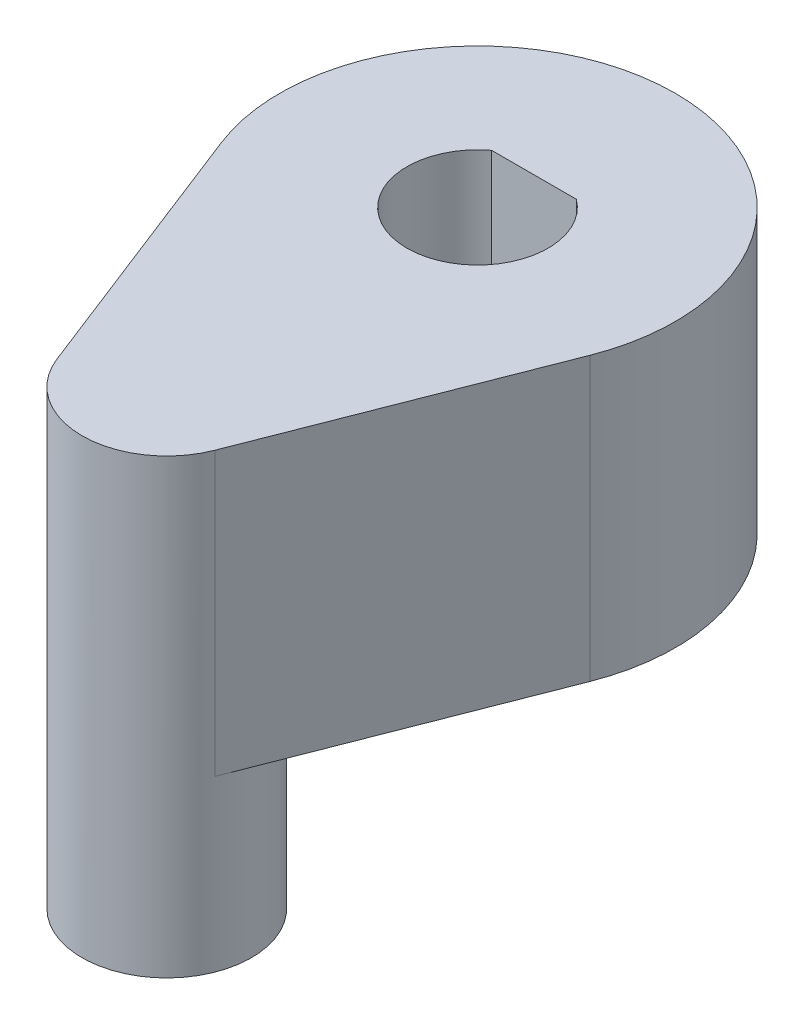
ISO-10303-21;
HEADER;
FILE_DESCRIPTION(('STEP AP214'),'2;1');
FILE_NAME('part.step','',(''),(''),'','','');
FILE_SCHEMA(('AUTOMOTIVE_DESIGN { 1 0 10303 214 1 1 1 1 }'));
ENDSEC;
DATA;
#1=APPLICATION_CONTEXT('core data for automotive mechanical design processes');
#2=APPLICATION_PROTOCOL_DEFINITION('international standard','automotive_design',2000,#1);
#3=PRODUCT_CONTEXT('',#1,'mechanical');
#4=PRODUCT('Part','Part','',(#3));
#5=PRODUCT_RELATED_PRODUCT_CATEGORY('part','',(#4));
#6=PRODUCT_DEFINITION_FORMATION('','',#4);
#7=PRODUCT_DEFINITION_CONTEXT('part definition',#1,'design');
#8=PRODUCT_DEFINITION('design','',#6,#7);
#9=PRODUCT_DEFINITION_SHAPE('','',#8);
#10=(LENGTH_UNIT() NAMED_UNIT(*) SI_UNIT(.MILLI.,.METRE.));
#11=(NAMED_UNIT(*) PLANE_ANGLE_UNIT() SI_UNIT($,.RADIAN.));
#12=(NAMED_UNIT(*) SI_UNIT($,.STERADIAN.) SOLID_ANGLE_UNIT());
#13=UNCERTAINTY_MEASURE_WITH_UNIT(LENGTH_MEASURE(1.E-05),#10,'distance_accuracy_value','');
#14=(GEOMETRIC_REPRESENTATION_CONTEXT(3) GLOBAL_UNCERTAINTY_ASSIGNED_CONTEXT((#13)) GLOBAL_UNIT_ASSIGNED_CONTEXT((#10,
#11,#12)) REPRESENTATION_CONTEXT('',''));
#15=CARTESIAN_POINT('',(0.,0.,0.));
#16=DIRECTION('',(0.,0.,1.));
#17=DIRECTION('',(1.,0.,0.));
#18=AXIS2_PLACEMENT_3D('',#15,#16,#17);
#19=CARTESIAN_POINT('',(-1.5,10.,-2.));
#20=DIRECTION('',(0.,0.,1.));
#21=DIRECTION('',(1.,0.,0.));
#22=AXIS2_PLACEMENT_3D('',#19,#20,#21);
#23=PLANE('',#22);
#24=CARTESIAN_POINT('',(0.,5.,-2.));
#25=DIRECTION('',(0.,0.,1.));
#26=DIRECTION('',(1.,0.,0.));
#27=AXIS2_PLACEMENT_3D('',#24,#25,#26);
#28=CIRCLE('',#27,1.55);
#29=CARTESIAN_POINT('',(1.5,5.39051248379533,-2.));
#30=VERTEX_POINT('',#29);
#31=CARTESIAN_POINT('',(-1.5,5.39051248379533,-2.));
#32=VERTEX_POINT('',#31);
#33=EDGE_CURVE('E167',#30,#32,#28,.T.);
#34=ORIENTED_EDGE('',*,*,#33,.F.);
#35=DIRECTION('',(0.,-1.,0.));
#36=VECTOR('',#35,1.);
#37=CARTESIAN_POINT('',(1.5,10.,-2.));
#38=LINE('',#37,#36);
#39=CARTESIAN_POINT('',(1.5,10.,-2.));
#40=VERTEX_POINT('',#39);
#41=EDGE_CURVE('E251',#40,#30,#38,.T.);
#42=ORIENTED_EDGE('',*,*,#41,.F.);
#43=DIRECTION('',(-1.,0.,0.));
#44=VECTOR('',#43,1.);
#45=CARTESIAN_POINT('',(-1.5,10.,-2.));
#46=LINE('',#45,#44);
#47=CARTESIAN_POINT('',(-1.5,10.,-2.));
#48=VERTEX_POINT('',#47);
#49=EDGE_CURVE('E239',#40,#48,#46,.T.);
#50=ORIENTED_EDGE('',*,*,#49,.T.);
#51=DIRECTION('',(0.,-1.,0.));
#52=VECTOR('',#51,1.);
#53=CARTESIAN_POINT('',(-1.5,10.,-2.));
#54=LINE('',#53,#52);
#55=EDGE_CURVE('E247',#48,#32,#54,.T.);
#56=ORIENTED_EDGE('',*,*,#55,.T.);
#57=EDGE_LOOP('',(#34,#42,#50,#56));
#58=FACE_BOUND('',#57,.T.);
#59=ADVANCED_FACE('F37',(#58),#23,.T.);
#60=CARTESIAN_POINT('',(0.,0.,0.));
#61=DIRECTION('',(0.,1.,0.));
#62=DIRECTION('',(0.,0.,1.));
#63=AXIS2_PLACEMENT_3D('',#60,#61,#62);
#64=PLANE('',#63);
#65=CARTESIAN_POINT('',(0.,0.,0.));
#66=DIRECTION('',(0.,1.,0.));
#67=DIRECTION('',(0.,0.,1.));
#68=AXIS2_PLACEMENT_3D('',#65,#66,#67);
#69=CIRCLE('',#68,2.5);
#70=CARTESIAN_POINT('',(-1.5,0.,-2.));
#71=VERTEX_POINT('',#70);
#72=CARTESIAN_POINT('',(1.5,0.,-2.));
#73=VERTEX_POINT('',#72);
#74=EDGE_CURVE('E235',#71,#73,#69,.T.);
#75=ORIENTED_EDGE('',*,*,#74,.T.);
#76=DIRECTION('',(-1.,0.,0.));
#77=VECTOR('',#76,1.);
#78=CARTESIAN_POINT('',(-1.5,0.,-2.));
#79=LINE('',#78,#77);
#80=EDGE_CURVE('E240',#73,#71,#79,.T.);
#81=ORIENTED_EDGE('',*,*,#80,.T.);
#82=EDGE_LOOP('',(#75,#81));
#83=FACE_BOUND('',#82,.T.);
#84=CARTESIAN_POINT('',(0.,0.,0.));
#85=DIRECTION('',(0.,1.,0.));
#86=DIRECTION('',(0.,0.,1.));
#87=AXIS2_PLACEMENT_3D('',#84,#85,#86);
#88=CIRCLE('',#87,7.);
#89=CARTESIAN_POINT('',(6.5207868510652,0.,2.54545454545454));
#90=VERTEX_POINT('',#89);
#91=CARTESIAN_POINT('',(-6.5207868510652,0.,2.54545454545454));
#92=VERTEX_POINT('',#91);
#93=EDGE_CURVE('E47',#90,#92,#88,.T.);
#94=ORIENTED_EDGE('',*,*,#93,.F.);
#95=DIRECTION('',(-0.363636363636364,0.,0.9315409787236));
#96=VECTOR('',#95,1.);
#97=CARTESIAN_POINT('',(6.5207868510652,0.,2.54545454545455));
#98=LINE('',#97,#96);
#99=CARTESIAN_POINT('',(2.7946229361708,0.,12.0909090909091));
#100=VERTEX_POINT('',#99);
#101=EDGE_CURVE('E160',#90,#100,#98,.T.);
#102=ORIENTED_EDGE('',*,*,#101,.T.);
#103=CARTESIAN_POINT('',(0.,0.,11.));
#104=DIRECTION('',(0.,1.,0.));
#105=DIRECTION('',(0.,0.,1.));
#106=AXIS2_PLACEMENT_3D('',#103,#104,#105);
#107=CIRCLE('',#106,3.);
#108=CARTESIAN_POINT('',(-2.7946229361708,0.,12.0909090909091));
#109=VERTEX_POINT('',#108);
#110=EDGE_CURVE('E131',#109,#100,#107,.F.);
#111=ORIENTED_EDGE('',*,*,#110,.F.);
#112=DIRECTION('',(-0.363636363636363,0.,-0.9315409787236));
#113=VECTOR('',#112,1.);
#114=CARTESIAN_POINT('',(-6.5207868510652,0.,2.54545454545454));
#115=LINE('',#114,#113);
#116=EDGE_CURVE('E158',#109,#92,#115,.T.);
#117=ORIENTED_EDGE('',*,*,#116,.T.);
#118=EDGE_LOOP('',(#94,#102,#111,#117));
#119=FACE_BOUND('',#118,.T.);
#120=DIRECTION('',(0.,0.,-1.));
#121=VECTOR('',#120,1.);
#122=CARTESIAN_POINT('',(2.85,0.,-5.25));
#123=LINE('',#122,#121);
#124=CARTESIAN_POINT('',(2.85,0.,-2.75));
#125=VERTEX_POINT('',#124);
#126=CARTESIAN_POINT('',(2.85,0.,-5.25));
#127=VERTEX_POINT('',#126);
#128=EDGE_CURVE('E204',#125,#127,#123,.T.);
#129=ORIENTED_EDGE('',*,*,#128,.T.);
#130=DIRECTION('',(-1.,0.,0.));
#131=VECTOR('',#130,1.);
#132=CARTESIAN_POINT('',(-2.85,0.,-5.25));
#133=LINE('',#132,#131);
#134=CARTESIAN_POINT('',(-2.85,0.,-5.25));
#135=VERTEX_POINT('',#134);
#136=EDGE_CURVE('E218',#127,#135,#133,.T.);
#137=ORIENTED_EDGE('',*,*,#136,.T.);
#138=DIRECTION('',(0.,0.,1.));
#139=VECTOR('',#138,1.);
#140=CARTESIAN_POINT('',(-2.85,0.,-5.25));
#141=LINE('',#140,#139);
#142=CARTESIAN_POINT('',(-2.85,0.,-2.75));
#143=VERTEX_POINT('',#142);
#144=EDGE_CURVE('E221',#135,#143,#141,.T.);
#145=ORIENTED_EDGE('',*,*,#144,.T.);
#146=DIRECTION('',(1.,0.,0.));
#147=VECTOR('',#146,1.);
#148=CARTESIAN_POINT('',(-2.85,0.,-2.75));
#149=LINE('',#148,#147);
#150=EDGE_CURVE('E209',#143,#125,#149,.T.);
#151=ORIENTED_EDGE('',*,*,#150,.T.);
#152=EDGE_LOOP('',(#129,#137,#145,#151));
#153=FACE_BOUND('',#152,.T.);
#154=ADVANCED_FACE('F264',(#83,#119,#153),#64,.F.);
#155=CARTESIAN_POINT('',(0.,10.,0.));
#156=DIRECTION('',(0.,1.,0.));
#157=DIRECTION('',(0.,0.,1.));
#158=AXIS2_PLACEMENT_3D('',#155,#156,#157);
#159=PLANE('',#158);
#160=CARTESIAN_POINT('',(0.,10.,0.));
#161=DIRECTION('',(0.,1.,0.));
#162=DIRECTION('',(0.,0.,1.));
#163=AXIS2_PLACEMENT_3D('',#160,#161,#162);
#164=CIRCLE('',#163,7.);
#165=CARTESIAN_POINT('',(6.5207868510652,10.,2.54545454545454));
#166=VERTEX_POINT('',#165);
#167=CARTESIAN_POINT('',(-6.5207868510652,10.,2.54545454545454));
#168=VERTEX_POINT('',#167);
#169=EDGE_CURVE('E11',#166,#168,#164,.T.);
#170=ORIENTED_EDGE('',*,*,#169,.T.);
#171=DIRECTION('',(0.363636363636363,0.,0.9315409787236));
#172=VECTOR('',#171,1.);
#173=CARTESIAN_POINT('',(-6.5207868510652,10.,2.54545454545454));
#174=LINE('',#173,#172);
#175=CARTESIAN_POINT('',(-2.7946229361708,10.,12.0909090909091));
#176=VERTEX_POINT('',#175);
#177=EDGE_CURVE('E146',#168,#176,#174,.T.);
#178=ORIENTED_EDGE('',*,*,#177,.T.);
#179=CARTESIAN_POINT('',(0.,10.,11.));
#180=DIRECTION('',(0.,1.,0.));
#181=DIRECTION('',(0.,0.,1.));
#182=AXIS2_PLACEMENT_3D('',#179,#180,#181);
#183=CIRCLE('',#182,3.);
#184=CARTESIAN_POINT('',(2.7946229361708,10.,12.0909090909091));
#185=VERTEX_POINT('',#184);
#186=EDGE_CURVE('E128',#185,#176,#183,.F.);
#187=ORIENTED_EDGE('',*,*,#186,.F.);
#188=DIRECTION('',(0.363636363636364,0.,-0.9315409787236));
#189=VECTOR('',#188,1.);
#190=CARTESIAN_POINT('',(6.5207868510652,10.,2.54545454545455));
#191=LINE('',#190,#189);
#192=EDGE_CURVE('E144',#185,#166,#191,.T.);
#193=ORIENTED_EDGE('',*,*,#192,.T.);
#194=EDGE_LOOP('',(#170,#178,#187,#193));
#195=FACE_BOUND('',#194,.T.);
#196=ORIENTED_EDGE('',*,*,#49,.F.);
#197=CARTESIAN_POINT('',(0.,10.,0.));
#198=DIRECTION('',(0.,1.,0.));
#199=DIRECTION('',(0.,0.,1.));
#200=AXIS2_PLACEMENT_3D('',#197,#198,#199);
#201=CIRCLE('',#200,2.5);
#202=EDGE_CURVE('E236',#48,#40,#201,.T.);
#203=ORIENTED_EDGE('',*,*,#202,.F.);
#204=EDGE_LOOP('',(#196,#203));
#205=FACE_BOUND('',#204,.T.);
#206=ADVANCED_FACE('F142',(#195,#205),#159,.T.);
#207=CARTESIAN_POINT('',(0.,10.,0.));
#208=DIRECTION('',(0.,-1.,0.));
#209=DIRECTION('',(0.,0.,-1.));
#210=AXIS2_PLACEMENT_3D('',#207,#208,#209);
#211=CYLINDRICAL_SURFACE('',#210,7.);
#212=CARTESIAN_POINT('',(0.,6.55,-7.));
#213=CARTESIAN_POINT('',(-0.0859402928343233,6.5499971026125,-6.99999841906637));
#214=CARTESIAN_POINT('',(-0.171915366286513,6.54282839045857,-6.99840128538259));
#215=CARTESIAN_POINT('',(-0.341421620554515,6.51437378637307,-6.99218430494816));
#216=CARTESIAN_POINT('',(-0.424951041449546,6.49307797704688,-6.98756233475606));
#217=CARTESIAN_POINT('',(-0.587091931546828,6.43707031796601,-6.97581007385335));
#218=CARTESIAN_POINT('',(-0.665708499775027,6.40237265593535,-6.96868243645437));
#219=CARTESIAN_POINT('',(-0.816001759123197,6.32059166784691,-6.95268727735697));
#220=CARTESIAN_POINT('',(-0.887678595155908,6.27350860049258,-6.94381979200109));
#221=CARTESIAN_POINT('',(-1.02323727587292,6.16747523843312,-6.92515283476601));
#222=CARTESIAN_POINT('',(-1.08698885409818,6.10836046704675,-6.91534156588722));
#223=CARTESIAN_POINT('',(-1.2037575950557,5.98029477158262,-6.89597555849522));
#224=CARTESIAN_POINT('',(-1.25677378159032,5.91134295396705,-6.88642084337959));
#225=CARTESIAN_POINT('',(-1.35114462199064,5.76459336115734,-6.86853324882406));
#226=CARTESIAN_POINT('',(-1.39236002454389,5.68670403110346,-6.86021547515364));
#227=CARTESIAN_POINT('',(-1.46106593396905,5.52489008405583,-6.84591309236291));
#228=CARTESIAN_POINT('',(-1.48855812582036,5.44096620945099,-6.8399281968242));
#229=CARTESIAN_POINT('',(-1.52860555632643,5.27088018450822,-6.83108944228684));
#230=CARTESIAN_POINT('',(-1.54139173571974,5.18477497692508,-6.82818723056561));
#231=CARTESIAN_POINT('',(-1.55238237694498,5.0115964575771,-6.82569726323977));
#232=CARTESIAN_POINT('',(-1.55058867730685,4.92452326925792,-6.82610908973325));
#233=CARTESIAN_POINT('',(-1.53265619455219,4.75360157459396,-6.83015691737853));
#234=CARTESIAN_POINT('',(-1.5167862412788,4.66972321520902,-6.83373249379431));
#235=CARTESIAN_POINT('',(-1.47157788763528,4.50584981217977,-6.84360934760427));
#236=CARTESIAN_POINT('',(-1.44223871480859,4.42585499154647,-6.84991078132453));
#237=CARTESIAN_POINT('',(-1.3706793767177,4.27126654075227,-6.86458854546672));
#238=CARTESIAN_POINT('',(-1.32835631982882,4.19672216824755,-6.87298134552846));
#239=CARTESIAN_POINT('',(-1.23210292316606,4.05569422415149,-6.89088615115621));
#240=CARTESIAN_POINT('',(-1.17817096399455,3.98921177919317,-6.9003983127849));
#241=CARTESIAN_POINT('',(-1.05881012883068,3.86464770376549,-6.91972892912363));
#242=CARTESIAN_POINT('',(-0.993152793365391,3.80678509686255,-6.92954949801286));
#243=CARTESIAN_POINT('',(-0.852954564444784,3.70285596847728,-6.94819843257607));
#244=CARTESIAN_POINT('',(-0.778413502253328,3.65678967110457,-6.95702677939775));
#245=CARTESIAN_POINT('',(-0.622292766056107,3.57770459198674,-6.97272633921555));
#246=CARTESIAN_POINT('',(-0.540697800900798,3.54471506756477,-6.97959315410242));
#247=CARTESIAN_POINT('',(-0.372936579150778,3.4929763360206,-6.99056333118812));
#248=CARTESIAN_POINT('',(-0.286771006253085,3.47422500546055,-6.99466710544747));
#249=CARTESIAN_POINT('',(-0.114192707035712,3.45181480209345,-6.99958997510097));
#250=CARTESIAN_POINT('',(-0.0278206262918196,3.44785681934468,-7.00047415849713));
#251=CARTESIAN_POINT('',(0.144350628221089,3.45433415510444,-6.99904086020288));
#252=CARTESIAN_POINT('',(0.230149841448108,3.46476847180506,-6.99672360135594));
#253=CARTESIAN_POINT('',(0.397744849449805,3.49948628898276,-6.9891889188855));
#254=CARTESIAN_POINT('',(0.479574864094173,3.52361239100744,-6.98400447294378));
#255=CARTESIAN_POINT('',(0.638026266705384,3.58485380965083,-6.97131593594165));
#256=CARTESIAN_POINT('',(0.714647202721151,3.62197025162666,-6.96381164391885));
#257=CARTESIAN_POINT('',(0.861738503621745,3.70875837976315,-6.94715559166856));
#258=CARTESIAN_POINT('',(0.932102988259884,3.75860511788197,-6.93798142071399));
#259=CARTESIAN_POINT('',(1.06357579121295,3.86920892615667,-6.91904806662473));
#260=CARTESIAN_POINT('',(1.12468287338637,3.92996745100095,-6.90928880560534));
#261=CARTESIAN_POINT('',(1.23709298830687,4.06204416094826,-6.89005959214247));
#262=CARTESIAN_POINT('',(1.2881886558264,4.13354038417455,-6.88059860681403));
#263=CARTESIAN_POINT('',(1.3776490309592,4.28427459888708,-6.86324763187886));
#264=CARTESIAN_POINT('',(1.41601429370752,4.36351225259748,-6.85535757377468));
#265=CARTESIAN_POINT('',(1.47866263467366,4.52705286879932,-6.84211830442032));
#266=CARTESIAN_POINT('',(1.50302558111365,4.61132401405355,-6.83675471468901));
#267=CARTESIAN_POINT('',(1.53721019423603,4.78289844328262,-6.82915054094163));
#268=CARTESIAN_POINT('',(1.54703425294282,4.87020122605481,-6.82690944319814));
#269=CARTESIAN_POINT('',(1.55175845978007,5.04326846298619,-6.82583693966597));
#270=CARTESIAN_POINT('',(1.54698758637967,5.12902363413171,-6.826930369878));
#271=CARTESIAN_POINT('',(1.52339423682576,5.2984754415871,-6.83223342154267));
#272=CARTESIAN_POINT('',(1.50457193485786,5.38217210340157,-6.83644300436657));
#273=CARTESIAN_POINT('',(1.45357074040883,5.54486187543883,-6.84746696206354));
#274=CARTESIAN_POINT('',(1.4214408580609,5.62387104094714,-6.85427177183658));
#275=CARTESIAN_POINT('',(1.34477823920642,5.7754258919239,-6.86972297868691));
#276=CARTESIAN_POINT('',(1.3002441737015,5.84797088371349,-6.87836957307173));
#277=CARTESIAN_POINT('',(1.19895108738809,5.98615727978365,-6.89675379681187));
#278=CARTESIAN_POINT('',(1.14195810498469,6.05162470700255,-6.90651030472363));
#279=CARTESIAN_POINT('',(1.01783769769875,6.17217431518667,-6.92588941792459));
#280=CARTESIAN_POINT('',(0.95070792977344,6.2272540884859,-6.93551199169281));
#281=CARTESIAN_POINT('',(0.807137839004441,6.32617098507363,-6.95369169401918));
#282=CARTESIAN_POINT('',(0.730585049628897,6.36984797476714,-6.96223286023274));
#283=CARTESIAN_POINT('',(0.571050729385048,6.4436452838494,-6.97712667819099));
#284=CARTESIAN_POINT('',(0.488074594741203,6.47377684088244,-6.98348114304984));
#285=CARTESIAN_POINT('',(0.337527303953331,6.51432972629152,-6.99216733927604));
#286=CARTESIAN_POINT('',(0.270763511878732,6.52768029202223,-6.99508623692342));
#287=CARTESIAN_POINT('',(0.136007036532056,6.54551636959757,-6.99900314828042));
#288=CARTESIAN_POINT('',(0.0680144104637138,6.55000229303504,-7.00000125117411));
#289=CARTESIAN_POINT('',(0.,6.55,-7.));
#290=B_SPLINE_CURVE_WITH_KNOTS('',3,(#212,#213,#214,#215,#216,#217,#218,#219,#220,#221,#222,
#223,#224,#225,#226,#227,#228,#229,#230,#231,#232,#233,#234,#235,#236,#237,#238,#239,#240,#241,
#242,#243,#244,#245,#246,#247,#248,#249,#250,#251,#252,#253,#254,#255,#256,#257,#258,#259,#260,
#261,#262,#263,#264,#265,#266,#267,#268,#269,#270,#271,#272,#273,#274,#275,#276,#277,#278,#279,
#280,#281,#282,#283,#284,#285,#286,#287,#288,#289),.UNSPECIFIED.,.T.,.F.,(4,2,2,2,2,2,2,2,2,2,2,
2,2,2,2,2,2,2,2,2,2,2,2,2,2,2,2,2,2,2,2,2,2,2,2,2,2,2,4),(0.,0.257571895706206,
0.515324801647956,0.772805584904142,1.03028099038845,1.29154626135011,1.55283527919716,
1.81709121175841,2.08131469015102,2.34132962168391,2.60131176571435,2.85643315384419,
3.11156917495343,3.36878168131653,3.6260300911236,3.88898398287271,4.15194286992383,
4.41548681160704,4.6789914414814,4.93713846382466,5.19526751817912,5.45048758897706,
5.70572977504243,5.96469086891337,6.22368651145372,6.48758231585737,6.7514666110378,
7.01383039666133,7.2761510118317,7.5326026688112,7.78905114679403,8.04456343925961,
8.30010311814187,8.56093215876119,8.82182158062535,9.08619854982529,9.35035577837665,
9.55421142653642,9.75805760928392),.UNSPECIFIED.);
#291=CARTESIAN_POINT('',(0.,6.55,-7.));
#292=VERTEX_POINT('',#291);
#293=EDGE_CURVE('E198',#292,#292,#290,.T.);
#294=ORIENTED_EDGE('',*,*,#293,.T.);
#295=EDGE_LOOP('',(#294));
#296=FACE_BOUND('',#295,.T.);
#297=ORIENTED_EDGE('',*,*,#169,.F.);
#298=DIRECTION('',(0.,1.,0.));
#299=VECTOR('',#298,1.);
#300=CARTESIAN_POINT('',(6.5207868510652,-16.1616319444367,2.54545454545454));
#301=LINE('',#300,#299);
#302=EDGE_CURVE('E136',#90,#166,#301,.T.);
#303=ORIENTED_EDGE('',*,*,#302,.F.);
#304=ORIENTED_EDGE('',*,*,#93,.T.);
#305=DIRECTION('',(0.,1.,0.));
#306=VECTOR('',#305,1.);
#307=CARTESIAN_POINT('',(-6.5207868510652,-16.1616319444367,2.54545454545454));
#308=LINE('',#307,#306);
#309=EDGE_CURVE('E59',#92,#168,#308,.T.);
#310=ORIENTED_EDGE('',*,*,#309,.T.);
#311=EDGE_LOOP('',(#297,#303,#304,#310));
#312=FACE_BOUND('',#311,.T.);
#313=ADVANCED_FACE('F39',(#296,#312),#211,.T.);
#314=CARTESIAN_POINT('',(0.,10.,0.));
#315=DIRECTION('',(0.,-1.,0.));
#316=DIRECTION('',(0.,0.,-1.));
#317=AXIS2_PLACEMENT_3D('',#314,#315,#316);
#318=CYLINDRICAL_SURFACE('',#317,2.5);
#319=CARTESIAN_POINT('',(-1.5,5.39051248379533,-2.));
#320=CARTESIAN_POINT('',(-1.50889726427483,5.3563390489348,-1.99332400059564));
#321=CARTESIAN_POINT('',(-1.51665892906326,5.32172827493054,-1.98741367603017));
#322=CARTESIAN_POINT('',(-1.52982546394848,5.25179839877789,-1.97729726484905));
#323=CARTESIAN_POINT('',(-1.53522906419274,5.21647892566602,-1.9730920965713));
#324=CARTESIAN_POINT('',(-1.54752941918455,5.11174060415883,-1.96348499081697));
#325=CARTESIAN_POINT('',(-1.55101676953309,5.04161986961238,-1.96070346690848));
#326=CARTESIAN_POINT('',(-1.54863283976531,4.91090202123434,-1.96258272824291));
#327=CARTESIAN_POINT('',(-1.5439306735321,4.85026378613153,-1.96631393591315));
#328=CARTESIAN_POINT('',(-1.53158276857935,4.7597621367887,-1.97592499163649));
#329=CARTESIAN_POINT('',(-1.52649094275629,4.72931240946195,-1.97986953956135));
#330=CARTESIAN_POINT('',(-1.51454923292454,4.66896119922362,-1.98901880052492));
#331=CARTESIAN_POINT('',(-1.50769991649543,4.63905954264731,-1.99422310669548));
#332=CARTESIAN_POINT('',(-1.5,4.60948751620467,-2.));
#333=B_SPLINE_CURVE_WITH_KNOTS('',3,(#319,#320,#321,#322,#323,#324,#325,#326,#327,#328,#329,
#330,#331,#332),.UNSPECIFIED.,.F.,.F.,(4,2,2,2,2,2,4),(0.,0.107765179269089,0.215588320276379,
0.425241060480937,0.607355307132323,0.70065446021502,0.793923520282873),.UNSPECIFIED.);
#334=CARTESIAN_POINT('',(-1.5,4.60948751620467,-2.));
#335=VERTEX_POINT('',#334);
#336=EDGE_CURVE('E175',#32,#335,#333,.T.);
#337=ORIENTED_EDGE('',*,*,#336,.F.);
#338=ORIENTED_EDGE('',*,*,#55,.F.);
#339=ORIENTED_EDGE('',*,*,#202,.T.);
#340=ORIENTED_EDGE('',*,*,#41,.T.);
#341=CARTESIAN_POINT('',(1.5,4.60948751620467,-2.));
#342=CARTESIAN_POINT('',(1.50889726427483,4.6436609510652,-1.99332400059564));
#343=CARTESIAN_POINT('',(1.51665892906326,4.67827172506946,-1.98741367603017));
#344=CARTESIAN_POINT('',(1.52982546394848,4.74820160122212,-1.97729726484905));
#345=CARTESIAN_POINT('',(1.53522906419274,4.78352107433398,-1.9730920965713));
#346=CARTESIAN_POINT('',(1.54752941918455,4.88825939584117,-1.96348499081697));
#347=CARTESIAN_POINT('',(1.55101676953309,4.95838013038762,-1.96070346690848));
#348=CARTESIAN_POINT('',(1.54863283976531,5.08909797876566,-1.96258272824291));
#349=CARTESIAN_POINT('',(1.5439306735321,5.14973621386847,-1.96631393591315));
#350=CARTESIAN_POINT('',(1.53158276857935,5.2402378632113,-1.97592499163649));
#351=CARTESIAN_POINT('',(1.52649094275629,5.27068759053805,-1.97986953956135));
#352=CARTESIAN_POINT('',(1.51454923292454,5.33103880077638,-1.98901880052492));
#353=CARTESIAN_POINT('',(1.50769991649543,5.36094045735269,-1.99422310669548));
#354=CARTESIAN_POINT('',(1.5,5.39051248379533,-2.));
#355=B_SPLINE_CURVE_WITH_KNOTS('',3,(#341,#342,#343,#344,#345,#346,#347,#348,#349,#350,#351,
#352,#353,#354),.UNSPECIFIED.,.F.,.F.,(4,2,2,2,2,2,4),(0.,0.10776517926909,0.215588320276379,
0.425241060480937,0.607355307132323,0.70065446021502,0.793923520282873),.UNSPECIFIED.);
#356=CARTESIAN_POINT('',(1.5,4.60948751620467,-2.));
#357=VERTEX_POINT('',#356);
#358=EDGE_CURVE('E166',#357,#30,#355,.T.);
#359=ORIENTED_EDGE('',*,*,#358,.F.);
#360=EDGE_CURVE('E250',#357,#73,#38,.T.);
#361=ORIENTED_EDGE('',*,*,#360,.T.);
#362=ORIENTED_EDGE('',*,*,#74,.F.);
#363=EDGE_CURVE('E242',#335,#71,#54,.T.);
#364=ORIENTED_EDGE('',*,*,#363,.F.);
#365=EDGE_LOOP('',(#337,#338,#339,#340,#359,#361,#362,#364));
#366=FACE_BOUND('',#365,.T.);
#367=ADVANCED_FACE('F181',(#366),#318,.F.);
#368=EDGE_CURVE('E164',#335,#357,#28,.T.);
#369=ORIENTED_EDGE('',*,*,#368,.F.);
#370=ORIENTED_EDGE('',*,*,#363,.T.);
#371=ORIENTED_EDGE('',*,*,#80,.F.);
#372=ORIENTED_EDGE('',*,*,#360,.F.);
#373=EDGE_LOOP('',(#369,#370,#371,#372));
#374=FACE_BOUND('',#373,.T.);
#375=ADVANCED_FACE('F262',(#374),#23,.T.);
#376=CARTESIAN_POINT('',(2.85,8.,-5.25));
#377=DIRECTION('',(-1.,0.,0.));
#378=DIRECTION('',(0.,0.,1.));
#379=AXIS2_PLACEMENT_3D('',#376,#377,#378);
#380=PLANE('',#379);
#381=ORIENTED_EDGE('',*,*,#128,.F.);
#382=DIRECTION('',(0.,-1.,0.));
#383=VECTOR('',#382,1.);
#384=CARTESIAN_POINT('',(2.85,8.,-2.75));
#385=LINE('',#384,#383);
#386=CARTESIAN_POINT('',(2.85,8.,-2.75));
#387=VERTEX_POINT('',#386);
#388=EDGE_CURVE('E215',#387,#125,#385,.T.);
#389=ORIENTED_EDGE('',*,*,#388,.F.);
#390=DIRECTION('',(0.,0.,-1.));
#391=VECTOR('',#390,1.);
#392=CARTESIAN_POINT('',(2.85,8.,-5.25));
#393=LINE('',#392,#391);
#394=CARTESIAN_POINT('',(2.85,8.,-5.25));
#395=VERTEX_POINT('',#394);
#396=EDGE_CURVE('E205',#387,#395,#393,.T.);
#397=ORIENTED_EDGE('',*,*,#396,.T.);
#398=DIRECTION('',(0.,-1.,0.));
#399=VECTOR('',#398,1.);
#400=CARTESIAN_POINT('',(2.85,8.,-5.25));
#401=LINE('',#400,#399);
#402=EDGE_CURVE('E232',#395,#127,#401,.T.);
#403=ORIENTED_EDGE('',*,*,#402,.T.);
#404=EDGE_LOOP('',(#381,#389,#397,#403));
#405=FACE_BOUND('',#404,.T.);
#406=ADVANCED_FACE('F271',(#405),#380,.T.);
#407=CARTESIAN_POINT('',(-2.85,8.,-5.25));
#408=DIRECTION('',(0.,0.,1.));
#409=DIRECTION('',(1.,0.,0.));
#410=AXIS2_PLACEMENT_3D('',#407,#408,#409);
#411=PLANE('',#410);
#412=CARTESIAN_POINT('',(0.,5.,-5.25));
#413=DIRECTION('',(0.,0.,1.));
#414=DIRECTION('',(1.,0.,0.));
#415=AXIS2_PLACEMENT_3D('',#412,#413,#414);
#416=CIRCLE('',#415,1.55);
#417=CARTESIAN_POINT('',(1.55,5.,-5.25));
#418=VERTEX_POINT('',#417);
#419=EDGE_CURVE('E161',#418,#418,#416,.T.);
#420=ORIENTED_EDGE('',*,*,#419,.F.);
#421=EDGE_LOOP('',(#420));
#422=FACE_BOUND('',#421,.T.);
#423=ORIENTED_EDGE('',*,*,#136,.F.);
#424=ORIENTED_EDGE('',*,*,#402,.F.);
#425=DIRECTION('',(-1.,0.,0.));
#426=VECTOR('',#425,1.);
#427=CARTESIAN_POINT('',(-2.85,8.,-5.25));
#428=LINE('',#427,#426);
#429=CARTESIAN_POINT('',(-2.85,8.,-5.25));
#430=VERTEX_POINT('',#429);
#431=EDGE_CURVE('E208',#395,#430,#428,.T.);
#432=ORIENTED_EDGE('',*,*,#431,.T.);
#433=DIRECTION('',(0.,-1.,0.));
#434=VECTOR('',#433,1.);
#435=CARTESIAN_POINT('',(-2.85,8.,-5.25));
#436=LINE('',#435,#434);
#437=EDGE_CURVE('E230',#430,#135,#436,.T.);
#438=ORIENTED_EDGE('',*,*,#437,.T.);
#439=EDGE_LOOP('',(#423,#424,#432,#438));
#440=FACE_BOUND('',#439,.T.);
#441=ADVANCED_FACE('F281',(#422,#440),#411,.T.);
#442=CARTESIAN_POINT('',(-2.85,8.,-5.25));
#443=DIRECTION('',(1.,0.,0.));
#444=DIRECTION('',(0.,0.,-1.));
#445=AXIS2_PLACEMENT_3D('',#442,#443,#444);
#446=PLANE('',#445);
#447=ORIENTED_EDGE('',*,*,#144,.F.);
#448=ORIENTED_EDGE('',*,*,#437,.F.);
#449=DIRECTION('',(0.,0.,1.));
#450=VECTOR('',#449,1.);
#451=CARTESIAN_POINT('',(-2.85,8.,-5.25));
#452=LINE('',#451,#450);
#453=CARTESIAN_POINT('',(-2.85,8.,-2.75));
#454=VERTEX_POINT('',#453);
#455=EDGE_CURVE('E211',#430,#454,#452,.T.);
#456=ORIENTED_EDGE('',*,*,#455,.T.);
#457=DIRECTION('',(0.,-1.,0.));
#458=VECTOR('',#457,1.);
#459=CARTESIAN_POINT('',(-2.85,8.,-2.75));
#460=LINE('',#459,#458);
#461=EDGE_CURVE('E228',#454,#143,#460,.T.);
#462=ORIENTED_EDGE('',*,*,#461,.T.);
#463=EDGE_LOOP('',(#447,#448,#456,#462));
#464=FACE_BOUND('',#463,.T.);
#465=ADVANCED_FACE('F285',(#464),#446,.T.);
#466=CARTESIAN_POINT('',(-2.85,8.,-2.75));
#467=DIRECTION('',(0.,0.,-1.));
#468=DIRECTION('',(-1.,0.,0.));
#469=AXIS2_PLACEMENT_3D('',#466,#467,#468);
#470=PLANE('',#469);
#471=CARTESIAN_POINT('',(0.,5.,-2.75));
#472=DIRECTION('',(0.,0.,-1.));
#473=DIRECTION('',(-1.,0.,0.));
#474=AXIS2_PLACEMENT_3D('',#471,#472,#473);
#475=CIRCLE('',#474,1.55);
#476=CARTESIAN_POINT('',(-1.55,5.,-2.75));
#477=VERTEX_POINT('',#476);
#478=EDGE_CURVE('E42',#477,#477,#475,.T.);
#479=ORIENTED_EDGE('',*,*,#478,.F.);
#480=EDGE_LOOP('',(#479));
#481=FACE_BOUND('',#480,.T.);
#482=ORIENTED_EDGE('',*,*,#150,.F.);
#483=ORIENTED_EDGE('',*,*,#461,.F.);
#484=DIRECTION('',(1.,0.,0.));
#485=VECTOR('',#484,1.);
#486=CARTESIAN_POINT('',(-2.85,8.,-2.75));
#487=LINE('',#486,#485);
#488=EDGE_CURVE('E213',#454,#387,#487,.T.);
#489=ORIENTED_EDGE('',*,*,#488,.T.);
#490=ORIENTED_EDGE('',*,*,#388,.T.);
#491=EDGE_LOOP('',(#482,#483,#489,#490));
#492=FACE_BOUND('',#491,.T.);
#493=ADVANCED_FACE('F275',(#481,#492),#470,.T.);
#494=CARTESIAN_POINT('',(0.,8.,0.));
#495=DIRECTION('',(0.,1.,0.));
#496=DIRECTION('',(0.,0.,1.));
#497=AXIS2_PLACEMENT_3D('',#494,#495,#496);
#498=PLANE('',#497);
#499=ORIENTED_EDGE('',*,*,#396,.F.);
#500=ORIENTED_EDGE('',*,*,#488,.F.);
#501=ORIENTED_EDGE('',*,*,#455,.F.);
#502=ORIENTED_EDGE('',*,*,#431,.F.);
#503=EDGE_LOOP('',(#499,#500,#501,#502));
#504=FACE_BOUND('',#503,.T.);
#505=ADVANCED_FACE('F191',(#504),#498,.F.);
#506=CARTESIAN_POINT('',(0.,5.,-7.));
#507=DIRECTION('',(0.,0.,1.));
#508=DIRECTION('',(1.,0.,0.));
#509=AXIS2_PLACEMENT_3D('',#506,#507,#508);
#510=CYLINDRICAL_SURFACE('',#509,1.55);
#511=ORIENTED_EDGE('',*,*,#33,.T.);
#512=ORIENTED_EDGE('',*,*,#336,.T.);
#513=ORIENTED_EDGE('',*,*,#368,.T.);
#514=ORIENTED_EDGE('',*,*,#358,.T.);
#515=EDGE_LOOP('',(#511,#512,#513,#514));
#516=FACE_BOUND('',#515,.T.);
#517=ORIENTED_EDGE('',*,*,#478,.T.);
#518=EDGE_LOOP('',(#517));
#519=FACE_BOUND('',#518,.T.);
#520=ADVANCED_FACE('F185',(#516,#519),#510,.F.);
#521=ORIENTED_EDGE('',*,*,#419,.T.);
#522=EDGE_LOOP('',(#521));
#523=FACE_BOUND('',#522,.T.);
#524=ORIENTED_EDGE('',*,*,#293,.F.);
#525=EDGE_LOOP('',(#524));
#526=FACE_BOUND('',#525,.T.);
#527=ADVANCED_FACE('F190',(#523,#526),#510,.F.);
#528=CARTESIAN_POINT('',(6.5207868510652,-16.1616319444367,2.54545454545455));
#529=DIRECTION('',(0.9315409787236,0.,0.363636363636364));
#530=DIRECTION('',(0.363636363636364,0.,-0.9315409787236));
#531=AXIS2_PLACEMENT_3D('',#528,#529,#530);
#532=PLANE('',#531);
#533=ORIENTED_EDGE('',*,*,#101,.F.);
#534=ORIENTED_EDGE('',*,*,#302,.T.);
#535=ORIENTED_EDGE('',*,*,#192,.F.);
#536=DIRECTION('',(0.,1.,0.));
#537=VECTOR('',#536,1.);
#538=CARTESIAN_POINT('',(2.7946229361708,-16.1616319444367,12.0909090909091));
#539=LINE('',#538,#537);
#540=EDGE_CURVE('E125',#100,#185,#539,.T.);
#541=ORIENTED_EDGE('',*,*,#540,.F.);
#542=EDGE_LOOP('',(#533,#534,#535,#541));
#543=FACE_BOUND('',#542,.T.);
#544=ADVANCED_FACE('F150',(#543),#532,.T.);
#545=CARTESIAN_POINT('',(-6.5207868510652,-16.1616319444367,2.54545454545454));
#546=DIRECTION('',(-0.9315409787236,0.,0.363636363636363));
#547=DIRECTION('',(0.363636363636363,0.,0.9315409787236));
#548=AXIS2_PLACEMENT_3D('',#545,#546,#547);
#549=PLANE('',#548);
#550=ORIENTED_EDGE('',*,*,#116,.F.);
#551=DIRECTION('',(0.,1.,0.));
#552=VECTOR('',#551,1.);
#553=CARTESIAN_POINT('',(-2.7946229361708,-16.1616319444367,12.0909090909091));
#554=LINE('',#553,#552);
#555=EDGE_CURVE('E137',#109,#176,#554,.T.);
#556=ORIENTED_EDGE('',*,*,#555,.T.);
#557=ORIENTED_EDGE('',*,*,#177,.F.);
#558=ORIENTED_EDGE('',*,*,#309,.F.);
#559=EDGE_LOOP('',(#550,#556,#557,#558));
#560=FACE_BOUND('',#559,.T.);
#561=ADVANCED_FACE('F193',(#560),#549,.T.);
#562=CARTESIAN_POINT('',(0.,18.4852813742386,11.));
#563=DIRECTION('',(0.,-1.,0.));
#564=DIRECTION('',(0.,0.,-1.));
#565=AXIS2_PLACEMENT_3D('',#562,#563,#564);
#566=CYLINDRICAL_SURFACE('',#565,3.);
#567=CARTESIAN_POINT('',(0.,-6.,11.));
#568=DIRECTION('',(0.,-1.,0.));
#569=DIRECTION('',(0.,0.,-1.));
#570=AXIS2_PLACEMENT_3D('',#567,#568,#569);
#571=CIRCLE('',#570,3.);
#572=CARTESIAN_POINT('',(0.,-6.,8.));
#573=VERTEX_POINT('',#572);
#574=EDGE_CURVE('E147',#573,#573,#571,.T.);
#575=ORIENTED_EDGE('',*,*,#574,.F.);
#576=EDGE_LOOP('',(#575));
#577=FACE_BOUND('',#576,.T.);
#578=ORIENTED_EDGE('',*,*,#540,.T.);
#579=ORIENTED_EDGE('',*,*,#186,.T.);
#580=ORIENTED_EDGE('',*,*,#555,.F.);
#581=ORIENTED_EDGE('',*,*,#110,.T.);
#582=EDGE_LOOP('',(#578,#579,#580,#581));
#583=FACE_BOUND('',#582,.T.);
#584=ADVANCED_FACE('F127',(#577,#583),#566,.T.);
#585=CARTESIAN_POINT('',(0.,-6.,11.));
#586=DIRECTION('',(0.,-1.,0.));
#587=DIRECTION('',(0.,0.,-1.));
#588=AXIS2_PLACEMENT_3D('',#585,#586,#587);
#589=PLANE('',#588);
#590=ORIENTED_EDGE('',*,*,#574,.T.);
#591=EDGE_LOOP('',(#590));
#592=FACE_BOUND('',#591,.T.);
#593=ADVANCED_FACE('F321',(#592),#589,.T.);
#594=CLOSED_SHELL('',(#59,#154,#206,#313,#367,#375,#406,#441,#465,#493,#505,#520,#527,#544,#561,
#584,#593));
#595=MANIFOLD_SOLID_BREP('B2',#594);
#596=ADVANCED_BREP_SHAPE_REPRESENTATION('',(#18,#595),#14);
#597=SHAPE_DEFINITION_REPRESENTATION(#9,#596);
ENDSEC;
END-ISO-10303-21;
